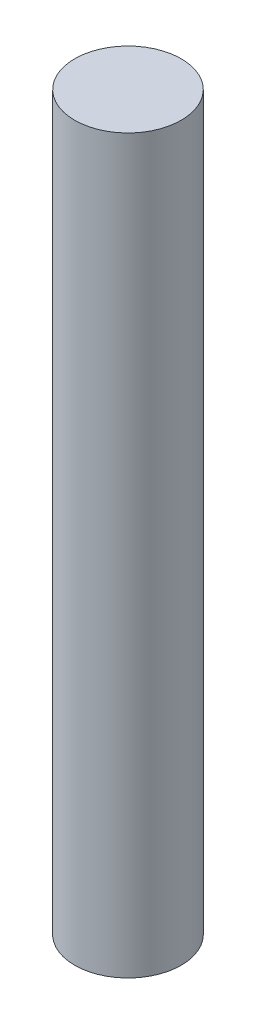
ISO-10303-21;
HEADER;
FILE_DESCRIPTION(('STEP AP214'),'2;1');
FILE_NAME('part.step','',(''),(''),'','','');
FILE_SCHEMA(('AUTOMOTIVE_DESIGN { 1 0 10303 214 1 1 1 1 }'));
ENDSEC;
DATA;
#1=APPLICATION_CONTEXT('core data for automotive mechanical design processes');
#2=APPLICATION_PROTOCOL_DEFINITION('international standard','automotive_design',2000,#1);
#3=PRODUCT_CONTEXT('',#1,'mechanical');
#4=PRODUCT('Part','Part','',(#3));
#5=PRODUCT_RELATED_PRODUCT_CATEGORY('part','',(#4));
#6=PRODUCT_DEFINITION_FORMATION('','',#4);
#7=PRODUCT_DEFINITION_CONTEXT('part definition',#1,'design');
#8=PRODUCT_DEFINITION('design','',#6,#7);
#9=PRODUCT_DEFINITION_SHAPE('','',#8);
#10=(LENGTH_UNIT() NAMED_UNIT(*) SI_UNIT(.MILLI.,.METRE.));
#11=(NAMED_UNIT(*) PLANE_ANGLE_UNIT() SI_UNIT($,.RADIAN.));
#12=(NAMED_UNIT(*) SI_UNIT($,.STERADIAN.) SOLID_ANGLE_UNIT());
#13=UNCERTAINTY_MEASURE_WITH_UNIT(LENGTH_MEASURE(1.E-05),#10,'distance_accuracy_value','');
#14=(GEOMETRIC_REPRESENTATION_CONTEXT(3) GLOBAL_UNCERTAINTY_ASSIGNED_CONTEXT((#13)) GLOBAL_UNIT_ASSIGNED_CONTEXT((#10,
#11,#12)) REPRESENTATION_CONTEXT('',''));
#15=CARTESIAN_POINT('',(0.,0.,0.));
#16=DIRECTION('',(0.,0.,1.));
#17=DIRECTION('',(1.,0.,0.));
#18=AXIS2_PLACEMENT_3D('',#15,#16,#17);
#19=CARTESIAN_POINT('',(0.,34.,0.));
#20=DIRECTION('',(0.,-1.,0.));
#21=DIRECTION('',(0.,0.,-1.));
#22=AXIS2_PLACEMENT_3D('',#19,#20,#21);
#23=CYLINDRICAL_SURFACE('',#22,2.475);
#24=CARTESIAN_POINT('',(0.,34.,0.));
#25=DIRECTION('',(0.,1.,0.));
#26=DIRECTION('',(0.,0.,1.));
#27=AXIS2_PLACEMENT_3D('',#24,#25,#26);
#28=CIRCLE('',#27,2.475);
#29=CARTESIAN_POINT('',(0.,34.,2.475));
#30=VERTEX_POINT('',#29);
#31=EDGE_CURVE('E10',#30,#30,#28,.T.);
#32=ORIENTED_EDGE('',*,*,#31,.F.);
#33=EDGE_LOOP('',(#32));
#34=FACE_BOUND('',#33,.T.);
#35=CARTESIAN_POINT('',(0.,0.,0.));
#36=DIRECTION('',(0.,1.,0.));
#37=DIRECTION('',(0.,0.,1.));
#38=AXIS2_PLACEMENT_3D('',#35,#36,#37);
#39=CIRCLE('',#38,2.475);
#40=CARTESIAN_POINT('',(0.,0.,2.475));
#41=VERTEX_POINT('',#40);
#42=EDGE_CURVE('E46',#41,#41,#39,.T.);
#43=ORIENTED_EDGE('',*,*,#42,.T.);
#44=EDGE_LOOP('',(#43));
#45=FACE_BOUND('',#44,.T.);
#46=ADVANCED_FACE('F43',(#34,#45),#23,.T.);
#47=CARTESIAN_POINT('',(0.,34.,0.));
#48=DIRECTION('',(0.,1.,0.));
#49=DIRECTION('',(0.,0.,1.));
#50=AXIS2_PLACEMENT_3D('',#47,#48,#49);
#51=PLANE('',#50);
#52=ORIENTED_EDGE('',*,*,#31,.T.);
#53=EDGE_LOOP('',(#52));
#54=FACE_BOUND('',#53,.T.);
#55=ADVANCED_FACE('F60',(#54),#51,.T.);
#56=CARTESIAN_POINT('',(0.,0.,0.));
#57=DIRECTION('',(0.,1.,0.));
#58=DIRECTION('',(0.,0.,1.));
#59=AXIS2_PLACEMENT_3D('',#56,#57,#58);
#60=PLANE('',#59);
#61=ORIENTED_EDGE('',*,*,#42,.F.);
#62=EDGE_LOOP('',(#61));
#63=FACE_BOUND('',#62,.T.);
#64=ADVANCED_FACE('F58',(#63),#60,.F.);
#65=CLOSED_SHELL('',(#46,#55,#64));
#66=MANIFOLD_SOLID_BREP('B2',#65);
#67=ADVANCED_BREP_SHAPE_REPRESENTATION('',(#18,#66),#14);
#68=SHAPE_DEFINITION_REPRESENTATION(#9,#67);
ENDSEC;
END-ISO-10303-21;
